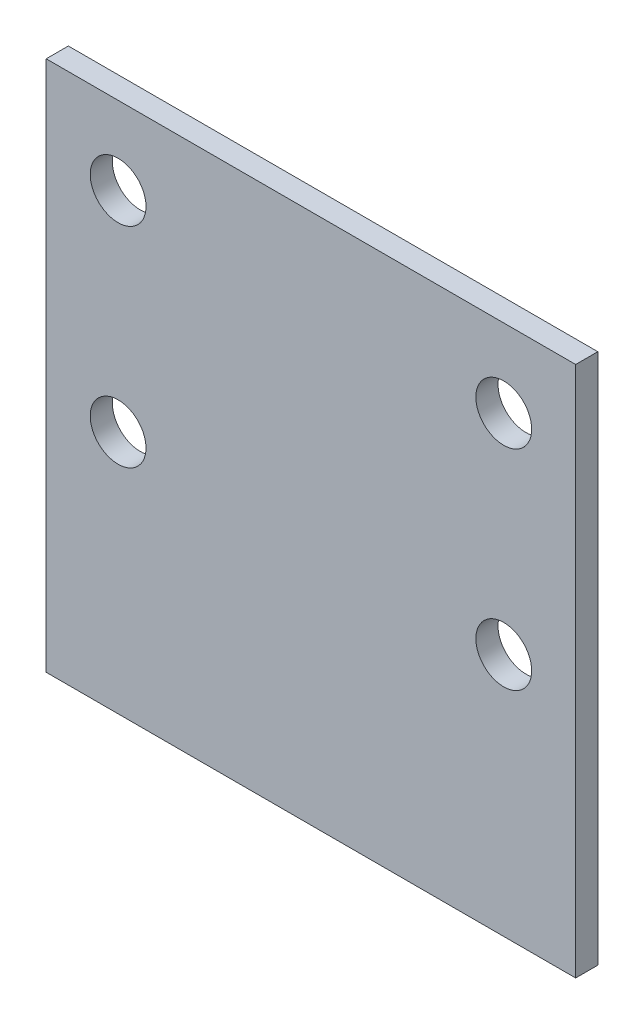
ISO-10303-21;
HEADER;
FILE_DESCRIPTION(('STEP AP214'),'2;1');
FILE_NAME('part.step','',(''),(''),'','','');
FILE_SCHEMA(('AUTOMOTIVE_DESIGN { 1 0 10303 214 1 1 1 1 }'));
ENDSEC;
DATA;
#1=APPLICATION_CONTEXT('core data for automotive mechanical design processes');
#2=APPLICATION_PROTOCOL_DEFINITION('international standard','automotive_design',2000,#1);
#3=PRODUCT_CONTEXT('',#1,'mechanical');
#4=PRODUCT('Part','Part','',(#3));
#5=PRODUCT_RELATED_PRODUCT_CATEGORY('part','',(#4));
#6=PRODUCT_DEFINITION_FORMATION('','',#4);
#7=PRODUCT_DEFINITION_CONTEXT('part definition',#1,'design');
#8=PRODUCT_DEFINITION('design','',#6,#7);
#9=PRODUCT_DEFINITION_SHAPE('','',#8);
#10=(LENGTH_UNIT() NAMED_UNIT(*) SI_UNIT(.MILLI.,.METRE.));
#11=(NAMED_UNIT(*) PLANE_ANGLE_UNIT() SI_UNIT($,.RADIAN.));
#12=(NAMED_UNIT(*) SI_UNIT($,.STERADIAN.) SOLID_ANGLE_UNIT());
#13=UNCERTAINTY_MEASURE_WITH_UNIT(LENGTH_MEASURE(1.E-05),#10,'distance_accuracy_value','');
#14=(GEOMETRIC_REPRESENTATION_CONTEXT(3) GLOBAL_UNCERTAINTY_ASSIGNED_CONTEXT((#13)) GLOBAL_UNIT_ASSIGNED_CONTEXT((#10,
#11,#12)) REPRESENTATION_CONTEXT('',''));
#15=CARTESIAN_POINT('',(0.,0.,0.));
#16=DIRECTION('',(0.,0.,1.));
#17=DIRECTION('',(1.,0.,0.));
#18=AXIS2_PLACEMENT_3D('',#15,#16,#17);
#19=CARTESIAN_POINT('',(0.,0.,3.175));
#20=DIRECTION('',(0.,0.,1.));
#21=DIRECTION('',(1.,0.,0.));
#22=AXIS2_PLACEMENT_3D('',#19,#20,#21);
#23=PLANE('',#22);
#24=CARTESIAN_POINT('',(40.2175999999999,65.,3.175));
#25=DIRECTION('',(0.,0.,1.));
#26=DIRECTION('',(1.,0.,0.));
#27=AXIS2_PLACEMENT_3D('',#24,#25,#26);
#28=CIRCLE('',#27,4.);
#29=CARTESIAN_POINT('',(44.2175999999999,65.,3.175));
#30=VERTEX_POINT('',#29);
#31=EDGE_CURVE('E124',#30,#30,#28,.T.);
#32=ORIENTED_EDGE('',*,*,#31,.F.);
#33=EDGE_LOOP('',(#32));
#34=FACE_BOUND('',#33,.T.);
#35=CARTESIAN_POINT('',(-15.0876,65.,3.175));
#36=DIRECTION('',(0.,0.,1.));
#37=DIRECTION('',(1.,0.,0.));
#38=AXIS2_PLACEMENT_3D('',#35,#36,#37);
#39=CIRCLE('',#38,4.);
#40=CARTESIAN_POINT('',(-11.0876,65.,3.175));
#41=VERTEX_POINT('',#40);
#42=EDGE_CURVE('E103',#41,#41,#39,.T.);
#43=ORIENTED_EDGE('',*,*,#42,.F.);
#44=EDGE_LOOP('',(#43));
#45=FACE_BOUND('',#44,.T.);
#46=DIRECTION('',(0.,-1.,0.));
#47=VECTOR('',#46,1.);
#48=CARTESIAN_POINT('',(-25.4,76.2,3.175));
#49=LINE('',#48,#47);
#50=CARTESIAN_POINT('',(-25.4,76.2,3.175));
#51=VERTEX_POINT('',#50);
#52=CARTESIAN_POINT('',(-25.4,0.,3.175));
#53=VERTEX_POINT('',#52);
#54=EDGE_CURVE('E88',#51,#53,#49,.T.);
#55=ORIENTED_EDGE('',*,*,#54,.T.);
#56=DIRECTION('',(1.,0.,0.));
#57=VECTOR('',#56,1.);
#58=CARTESIAN_POINT('',(-25.4,0.,3.175));
#59=LINE('',#58,#57);
#60=CARTESIAN_POINT('',(50.5299999999999,0.,3.175));
#61=VERTEX_POINT('',#60);
#62=EDGE_CURVE('E83',#53,#61,#59,.T.);
#63=ORIENTED_EDGE('',*,*,#62,.T.);
#64=DIRECTION('',(0.,1.,0.));
#65=VECTOR('',#64,1.);
#66=CARTESIAN_POINT('',(50.5299999999999,0.,3.175));
#67=LINE('',#66,#65);
#68=CARTESIAN_POINT('',(50.5299999999999,76.2,3.175));
#69=VERTEX_POINT('',#68);
#70=EDGE_CURVE('E86',#61,#69,#67,.T.);
#71=ORIENTED_EDGE('',*,*,#70,.T.);
#72=DIRECTION('',(-1.,0.,0.));
#73=VECTOR('',#72,1.);
#74=CARTESIAN_POINT('',(50.5299999999999,76.2,3.175));
#75=LINE('',#74,#73);
#76=EDGE_CURVE('E53',#69,#51,#75,.T.);
#77=ORIENTED_EDGE('',*,*,#76,.T.);
#78=EDGE_LOOP('',(#55,#63,#71,#77));
#79=FACE_BOUND('',#78,.T.);
#80=CARTESIAN_POINT('',(-15.0876,35.,3.175));
#81=DIRECTION('',(0.,0.,1.));
#82=DIRECTION('',(1.,0.,0.));
#83=AXIS2_PLACEMENT_3D('',#80,#81,#82);
#84=CIRCLE('',#83,3.99999999999999);
#85=CARTESIAN_POINT('',(-11.0876,35.,3.175));
#86=VERTEX_POINT('',#85);
#87=EDGE_CURVE('E118',#86,#86,#84,.T.);
#88=ORIENTED_EDGE('',*,*,#87,.F.);
#89=EDGE_LOOP('',(#88));
#90=FACE_BOUND('',#89,.T.);
#91=CARTESIAN_POINT('',(40.2175999999999,35.,3.175));
#92=DIRECTION('',(0.,0.,1.));
#93=DIRECTION('',(1.,0.,0.));
#94=AXIS2_PLACEMENT_3D('',#91,#92,#93);
#95=CIRCLE('',#94,3.99999999999999);
#96=CARTESIAN_POINT('',(44.2175999999999,35.,3.175));
#97=VERTEX_POINT('',#96);
#98=EDGE_CURVE('E130',#97,#97,#95,.T.);
#99=ORIENTED_EDGE('',*,*,#98,.F.);
#100=EDGE_LOOP('',(#99));
#101=FACE_BOUND('',#100,.T.);
#102=ADVANCED_FACE('F36',(#34,#45,#79,#90,#101),#23,.T.);
#103=CARTESIAN_POINT('',(0.,0.,0.));
#104=DIRECTION('',(0.,0.,1.));
#105=DIRECTION('',(1.,0.,0.));
#106=AXIS2_PLACEMENT_3D('',#103,#104,#105);
#107=PLANE('',#106);
#108=DIRECTION('',(0.,-1.,0.));
#109=VECTOR('',#108,1.);
#110=CARTESIAN_POINT('',(-25.4,76.2,0.));
#111=LINE('',#110,#109);
#112=CARTESIAN_POINT('',(-25.4,76.2,0.));
#113=VERTEX_POINT('',#112);
#114=CARTESIAN_POINT('',(-25.4,0.,0.));
#115=VERTEX_POINT('',#114);
#116=EDGE_CURVE('E100',#113,#115,#111,.T.);
#117=ORIENTED_EDGE('',*,*,#116,.F.);
#118=DIRECTION('',(-1.,0.,0.));
#119=VECTOR('',#118,1.);
#120=CARTESIAN_POINT('',(50.5299999999999,76.2,0.));
#121=LINE('',#120,#119);
#122=CARTESIAN_POINT('',(50.5299999999999,76.2,0.));
#123=VERTEX_POINT('',#122);
#124=EDGE_CURVE('E76',#123,#113,#121,.T.);
#125=ORIENTED_EDGE('',*,*,#124,.F.);
#126=DIRECTION('',(0.,1.,0.));
#127=VECTOR('',#126,1.);
#128=CARTESIAN_POINT('',(50.5299999999999,0.,0.));
#129=LINE('',#128,#127);
#130=CARTESIAN_POINT('',(50.5299999999999,0.,0.));
#131=VERTEX_POINT('',#130);
#132=EDGE_CURVE('E70',#131,#123,#129,.T.);
#133=ORIENTED_EDGE('',*,*,#132,.F.);
#134=DIRECTION('',(1.,0.,0.));
#135=VECTOR('',#134,1.);
#136=CARTESIAN_POINT('',(-25.4,0.,0.));
#137=LINE('',#136,#135);
#138=EDGE_CURVE('E92',#115,#131,#137,.T.);
#139=ORIENTED_EDGE('',*,*,#138,.F.);
#140=EDGE_LOOP('',(#117,#125,#133,#139));
#141=FACE_BOUND('',#140,.T.);
#142=CARTESIAN_POINT('',(-15.0876,65.,0.));
#143=DIRECTION('',(0.,0.,1.));
#144=DIRECTION('',(1.,0.,0.));
#145=AXIS2_PLACEMENT_3D('',#142,#143,#144);
#146=CIRCLE('',#145,4.);
#147=CARTESIAN_POINT('',(-11.0876,65.,0.));
#148=VERTEX_POINT('',#147);
#149=EDGE_CURVE('E115',#148,#148,#146,.T.);
#150=ORIENTED_EDGE('',*,*,#149,.T.);
#151=EDGE_LOOP('',(#150));
#152=FACE_BOUND('',#151,.T.);
#153=CARTESIAN_POINT('',(-15.0876,35.,0.));
#154=DIRECTION('',(0.,0.,1.));
#155=DIRECTION('',(1.,0.,0.));
#156=AXIS2_PLACEMENT_3D('',#153,#154,#155);
#157=CIRCLE('',#156,3.99999999999999);
#158=CARTESIAN_POINT('',(-11.0876,35.,0.));
#159=VERTEX_POINT('',#158);
#160=EDGE_CURVE('E121',#159,#159,#157,.T.);
#161=ORIENTED_EDGE('',*,*,#160,.T.);
#162=EDGE_LOOP('',(#161));
#163=FACE_BOUND('',#162,.T.);
#164=CARTESIAN_POINT('',(40.2175999999999,65.,0.));
#165=DIRECTION('',(0.,0.,1.));
#166=DIRECTION('',(1.,0.,0.));
#167=AXIS2_PLACEMENT_3D('',#164,#165,#166);
#168=CIRCLE('',#167,4.);
#169=CARTESIAN_POINT('',(44.2175999999999,65.,0.));
#170=VERTEX_POINT('',#169);
#171=EDGE_CURVE('E127',#170,#170,#168,.T.);
#172=ORIENTED_EDGE('',*,*,#171,.T.);
#173=EDGE_LOOP('',(#172));
#174=FACE_BOUND('',#173,.T.);
#175=CARTESIAN_POINT('',(40.2175999999999,35.,0.));
#176=DIRECTION('',(0.,0.,1.));
#177=DIRECTION('',(1.,0.,0.));
#178=AXIS2_PLACEMENT_3D('',#175,#176,#177);
#179=CIRCLE('',#178,3.99999999999999);
#180=CARTESIAN_POINT('',(44.2175999999999,35.,0.));
#181=VERTEX_POINT('',#180);
#182=EDGE_CURVE('E133',#181,#181,#179,.T.);
#183=ORIENTED_EDGE('',*,*,#182,.T.);
#184=EDGE_LOOP('',(#183));
#185=FACE_BOUND('',#184,.T.);
#186=ADVANCED_FACE('F111',(#141,#152,#163,#174,#185),#107,.F.);
#187=CARTESIAN_POINT('',(-25.4,76.2,3.175));
#188=DIRECTION('',(1.,0.,0.));
#189=DIRECTION('',(0.,0.,-1.));
#190=AXIS2_PLACEMENT_3D('',#187,#188,#189);
#191=PLANE('',#190);
#192=ORIENTED_EDGE('',*,*,#116,.T.);
#193=DIRECTION('',(0.,0.,-1.));
#194=VECTOR('',#193,1.);
#195=CARTESIAN_POINT('',(-25.4,0.,3.175));
#196=LINE('',#195,#194);
#197=EDGE_CURVE('E11',#53,#115,#196,.T.);
#198=ORIENTED_EDGE('',*,*,#197,.F.);
#199=ORIENTED_EDGE('',*,*,#54,.F.);
#200=DIRECTION('',(0.,0.,-1.));
#201=VECTOR('',#200,1.);
#202=CARTESIAN_POINT('',(-25.4,76.2,3.175));
#203=LINE('',#202,#201);
#204=EDGE_CURVE('E96',#51,#113,#203,.T.);
#205=ORIENTED_EDGE('',*,*,#204,.T.);
#206=EDGE_LOOP('',(#192,#198,#199,#205));
#207=FACE_BOUND('',#206,.T.);
#208=ADVANCED_FACE('F38',(#207),#191,.F.);
#209=CARTESIAN_POINT('',(-25.4,0.,3.175));
#210=DIRECTION('',(0.,1.,0.));
#211=DIRECTION('',(-1.,0.,0.));
#212=AXIS2_PLACEMENT_3D('',#209,#210,#211);
#213=PLANE('',#212);
#214=ORIENTED_EDGE('',*,*,#138,.T.);
#215=DIRECTION('',(0.,0.,-1.));
#216=VECTOR('',#215,1.);
#217=CARTESIAN_POINT('',(50.5299999999999,0.,3.175));
#218=LINE('',#217,#216);
#219=EDGE_CURVE('E45',#61,#131,#218,.T.);
#220=ORIENTED_EDGE('',*,*,#219,.F.);
#221=ORIENTED_EDGE('',*,*,#62,.F.);
#222=ORIENTED_EDGE('',*,*,#197,.T.);
#223=EDGE_LOOP('',(#214,#220,#221,#222));
#224=FACE_BOUND('',#223,.T.);
#225=ADVANCED_FACE('F91',(#224),#213,.F.);
#226=CARTESIAN_POINT('',(50.5299999999999,0.,3.175));
#227=DIRECTION('',(-1.,0.,0.));
#228=DIRECTION('',(0.,0.,1.));
#229=AXIS2_PLACEMENT_3D('',#226,#227,#228);
#230=PLANE('',#229);
#231=ORIENTED_EDGE('',*,*,#132,.T.);
#232=DIRECTION('',(0.,0.,-1.));
#233=VECTOR('',#232,1.);
#234=CARTESIAN_POINT('',(50.5299999999999,76.2,3.175));
#235=LINE('',#234,#233);
#236=EDGE_CURVE('E93',#69,#123,#235,.T.);
#237=ORIENTED_EDGE('',*,*,#236,.F.);
#238=ORIENTED_EDGE('',*,*,#70,.F.);
#239=ORIENTED_EDGE('',*,*,#219,.T.);
#240=EDGE_LOOP('',(#231,#237,#238,#239));
#241=FACE_BOUND('',#240,.T.);
#242=ADVANCED_FACE('F94',(#241),#230,.F.);
#243=CARTESIAN_POINT('',(50.5299999999999,76.2,3.175));
#244=DIRECTION('',(0.,-1.,0.));
#245=DIRECTION('',(1.,0.,0.));
#246=AXIS2_PLACEMENT_3D('',#243,#244,#245);
#247=PLANE('',#246);
#248=ORIENTED_EDGE('',*,*,#124,.T.);
#249=ORIENTED_EDGE('',*,*,#204,.F.);
#250=ORIENTED_EDGE('',*,*,#76,.F.);
#251=ORIENTED_EDGE('',*,*,#236,.T.);
#252=EDGE_LOOP('',(#248,#249,#250,#251));
#253=FACE_BOUND('',#252,.T.);
#254=ADVANCED_FACE('F108',(#253),#247,.F.);
#255=CARTESIAN_POINT('',(-15.0876,65.,3.175));
#256=DIRECTION('',(0.,0.,-1.));
#257=DIRECTION('',(-1.,0.,0.));
#258=AXIS2_PLACEMENT_3D('',#255,#256,#257);
#259=CYLINDRICAL_SURFACE('',#258,4.);
#260=ORIENTED_EDGE('',*,*,#42,.T.);
#261=EDGE_LOOP('',(#260));
#262=FACE_BOUND('',#261,.T.);
#263=ORIENTED_EDGE('',*,*,#149,.F.);
#264=EDGE_LOOP('',(#263));
#265=FACE_BOUND('',#264,.T.);
#266=ADVANCED_FACE('F152',(#262,#265),#259,.F.);
#267=CARTESIAN_POINT('',(-15.0876,35.,3.175));
#268=DIRECTION('',(0.,0.,-1.));
#269=DIRECTION('',(-1.,0.,0.));
#270=AXIS2_PLACEMENT_3D('',#267,#268,#269);
#271=CYLINDRICAL_SURFACE('',#270,3.99999999999999);
#272=ORIENTED_EDGE('',*,*,#87,.T.);
#273=EDGE_LOOP('',(#272));
#274=FACE_BOUND('',#273,.T.);
#275=ORIENTED_EDGE('',*,*,#160,.F.);
#276=EDGE_LOOP('',(#275));
#277=FACE_BOUND('',#276,.T.);
#278=ADVANCED_FACE('F206',(#274,#277),#271,.F.);
#279=CARTESIAN_POINT('',(40.2175999999999,65.,3.175));
#280=DIRECTION('',(0.,0.,-1.));
#281=DIRECTION('',(-1.,0.,0.));
#282=AXIS2_PLACEMENT_3D('',#279,#280,#281);
#283=CYLINDRICAL_SURFACE('',#282,4.);
#284=ORIENTED_EDGE('',*,*,#31,.T.);
#285=EDGE_LOOP('',(#284));
#286=FACE_BOUND('',#285,.T.);
#287=ORIENTED_EDGE('',*,*,#171,.F.);
#288=EDGE_LOOP('',(#287));
#289=FACE_BOUND('',#288,.T.);
#290=ADVANCED_FACE('F215',(#286,#289),#283,.F.);
#291=CARTESIAN_POINT('',(40.2175999999999,35.,3.175));
#292=DIRECTION('',(0.,0.,-1.));
#293=DIRECTION('',(-1.,0.,0.));
#294=AXIS2_PLACEMENT_3D('',#291,#292,#293);
#295=CYLINDRICAL_SURFACE('',#294,3.99999999999999);
#296=ORIENTED_EDGE('',*,*,#98,.T.);
#297=EDGE_LOOP('',(#296));
#298=FACE_BOUND('',#297,.T.);
#299=ORIENTED_EDGE('',*,*,#182,.F.);
#300=EDGE_LOOP('',(#299));
#301=FACE_BOUND('',#300,.T.);
#302=ADVANCED_FACE('F139',(#298,#301),#295,.F.);
#303=CLOSED_SHELL('',(#102,#186,#208,#225,#242,#254,#266,#278,#290,#302));
#304=MANIFOLD_SOLID_BREP('B2',#303);
#305=ADVANCED_BREP_SHAPE_REPRESENTATION('',(#18,#304),#14);
#306=SHAPE_DEFINITION_REPRESENTATION(#9,#305);
ENDSEC;
END-ISO-10303-21;
